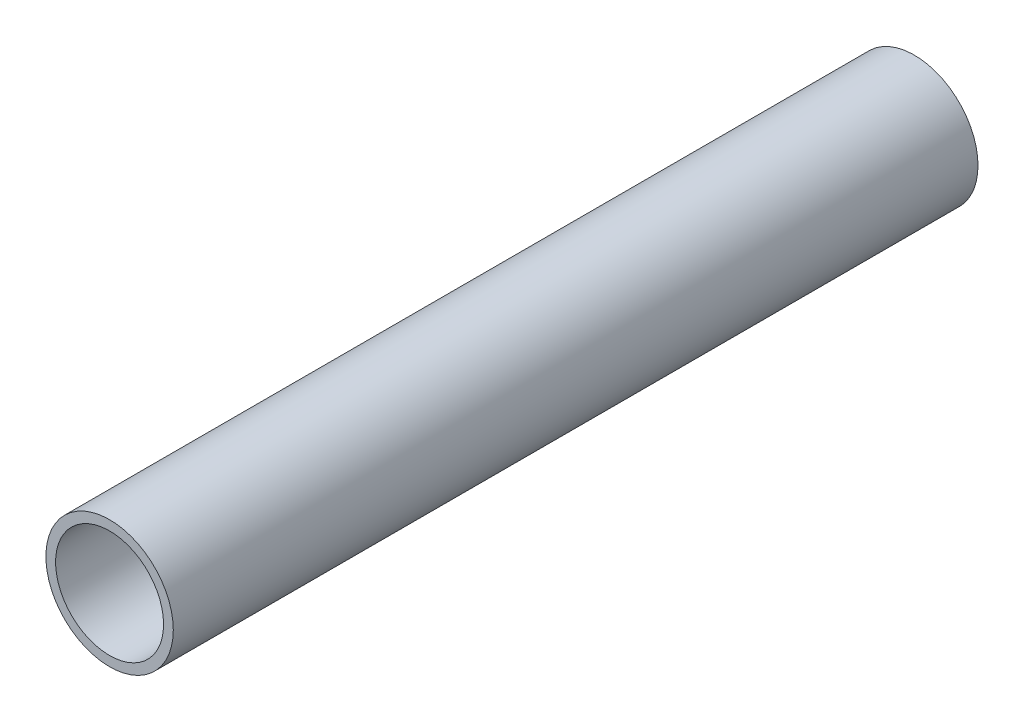
ISO-10303-21;
HEADER;
FILE_DESCRIPTION(('STEP AP214'),'2;1');
FILE_NAME('part.step','',(''),(''),'','','');
FILE_SCHEMA(('AUTOMOTIVE_DESIGN { 1 0 10303 214 1 1 1 1 }'));
ENDSEC;
DATA;
#1=APPLICATION_CONTEXT('core data for automotive mechanical design processes');
#2=APPLICATION_PROTOCOL_DEFINITION('international standard','automotive_design',2000,#1);
#3=PRODUCT_CONTEXT('',#1,'mechanical');
#4=PRODUCT('Part','Part','',(#3));
#5=PRODUCT_RELATED_PRODUCT_CATEGORY('part','',(#4));
#6=PRODUCT_DEFINITION_FORMATION('','',#4);
#7=PRODUCT_DEFINITION_CONTEXT('part definition',#1,'design');
#8=PRODUCT_DEFINITION('design','',#6,#7);
#9=PRODUCT_DEFINITION_SHAPE('','',#8);
#10=(LENGTH_UNIT() NAMED_UNIT(*) SI_UNIT(.MILLI.,.METRE.));
#11=(NAMED_UNIT(*) PLANE_ANGLE_UNIT() SI_UNIT($,.RADIAN.));
#12=(NAMED_UNIT(*) SI_UNIT($,.STERADIAN.) SOLID_ANGLE_UNIT());
#13=UNCERTAINTY_MEASURE_WITH_UNIT(LENGTH_MEASURE(1.E-05),#10,'distance_accuracy_value','');
#14=(GEOMETRIC_REPRESENTATION_CONTEXT(3) GLOBAL_UNCERTAINTY_ASSIGNED_CONTEXT((#13)) GLOBAL_UNIT_ASSIGNED_CONTEXT((#10,
#11,#12)) REPRESENTATION_CONTEXT('',''));
#15=CARTESIAN_POINT('',(0.,0.,0.));
#16=DIRECTION('',(0.,0.,1.));
#17=DIRECTION('',(1.,0.,0.));
#18=AXIS2_PLACEMENT_3D('',#15,#16,#17);
#19=CARTESIAN_POINT('',(0.,0.,-152.4));
#20=DIRECTION('',(0.,0.,1.));
#21=DIRECTION('',(1.,0.,0.));
#22=AXIS2_PLACEMENT_3D('',#19,#20,#21);
#23=CYLINDRICAL_SURFACE('',#22,24.13);
#24=CARTESIAN_POINT('',(0.,0.,-152.4));
#25=DIRECTION('',(0.,0.,1.));
#26=DIRECTION('',(1.,0.,0.));
#27=AXIS2_PLACEMENT_3D('',#24,#25,#26);
#28=CIRCLE('',#27,24.13);
#29=CARTESIAN_POINT('',(24.13,0.,-152.4));
#30=VERTEX_POINT('',#29);
#31=EDGE_CURVE('E10',#30,#30,#28,.T.);
#32=ORIENTED_EDGE('',*,*,#31,.T.);
#33=EDGE_LOOP('',(#32));
#34=FACE_BOUND('',#33,.T.);
#35=CARTESIAN_POINT('',(0.,0.,152.4));
#36=DIRECTION('',(0.,0.,1.));
#37=DIRECTION('',(1.,0.,0.));
#38=AXIS2_PLACEMENT_3D('',#35,#36,#37);
#39=CIRCLE('',#38,24.13);
#40=CARTESIAN_POINT('',(24.13,0.,152.4));
#41=VERTEX_POINT('',#40);
#42=EDGE_CURVE('E49',#41,#41,#39,.T.);
#43=ORIENTED_EDGE('',*,*,#42,.F.);
#44=EDGE_LOOP('',(#43));
#45=FACE_BOUND('',#44,.T.);
#46=ADVANCED_FACE('F37',(#34,#45),#23,.T.);
#47=CARTESIAN_POINT('',(0.,0.,-152.4));
#48=DIRECTION('',(0.,0.,1.));
#49=DIRECTION('',(1.,0.,0.));
#50=AXIS2_PLACEMENT_3D('',#47,#48,#49);
#51=PLANE('',#50);
#52=CARTESIAN_POINT('',(0.,0.,-152.4));
#53=DIRECTION('',(0.,0.,1.));
#54=DIRECTION('',(1.,0.,0.));
#55=AXIS2_PLACEMENT_3D('',#52,#53,#54);
#56=CIRCLE('',#55,20.447);
#57=CARTESIAN_POINT('',(20.447,0.,-152.4));
#58=VERTEX_POINT('',#57);
#59=EDGE_CURVE('E44',#58,#58,#56,.T.);
#60=ORIENTED_EDGE('',*,*,#59,.T.);
#61=EDGE_LOOP('',(#60));
#62=FACE_BOUND('',#61,.T.);
#63=ORIENTED_EDGE('',*,*,#31,.F.);
#64=EDGE_LOOP('',(#63));
#65=FACE_BOUND('',#64,.T.);
#66=ADVANCED_FACE('F70',(#62,#65),#51,.F.);
#67=CARTESIAN_POINT('',(0.,0.,-152.4));
#68=DIRECTION('',(0.,0.,1.));
#69=DIRECTION('',(1.,0.,0.));
#70=AXIS2_PLACEMENT_3D('',#67,#68,#69);
#71=CYLINDRICAL_SURFACE('',#70,20.447);
#72=ORIENTED_EDGE('',*,*,#59,.F.);
#73=EDGE_LOOP('',(#72));
#74=FACE_BOUND('',#73,.T.);
#75=CARTESIAN_POINT('',(0.,0.,152.4));
#76=DIRECTION('',(0.,0.,1.));
#77=DIRECTION('',(1.,0.,0.));
#78=AXIS2_PLACEMENT_3D('',#75,#76,#77);
#79=CIRCLE('',#78,20.447);
#80=CARTESIAN_POINT('',(20.447,0.,152.4));
#81=VERTEX_POINT('',#80);
#82=EDGE_CURVE('E54',#81,#81,#79,.T.);
#83=ORIENTED_EDGE('',*,*,#82,.T.);
#84=EDGE_LOOP('',(#83));
#85=FACE_BOUND('',#84,.T.);
#86=ADVANCED_FACE('F61',(#74,#85),#71,.F.);
#87=CARTESIAN_POINT('',(0.,0.,152.4));
#88=DIRECTION('',(0.,0.,1.));
#89=DIRECTION('',(1.,0.,0.));
#90=AXIS2_PLACEMENT_3D('',#87,#88,#89);
#91=PLANE('',#90);
#92=ORIENTED_EDGE('',*,*,#42,.T.);
#93=EDGE_LOOP('',(#92));
#94=FACE_BOUND('',#93,.T.);
#95=ORIENTED_EDGE('',*,*,#82,.F.);
#96=EDGE_LOOP('',(#95));
#97=FACE_BOUND('',#96,.T.);
#98=ADVANCED_FACE('F63',(#94,#97),#91,.T.);
#99=CLOSED_SHELL('',(#46,#66,#86,#98));
#100=MANIFOLD_SOLID_BREP('B2',#99);
#101=ADVANCED_BREP_SHAPE_REPRESENTATION('',(#18,#100),#14);
#102=SHAPE_DEFINITION_REPRESENTATION(#9,#101);
ENDSEC;
END-ISO-10303-21;
